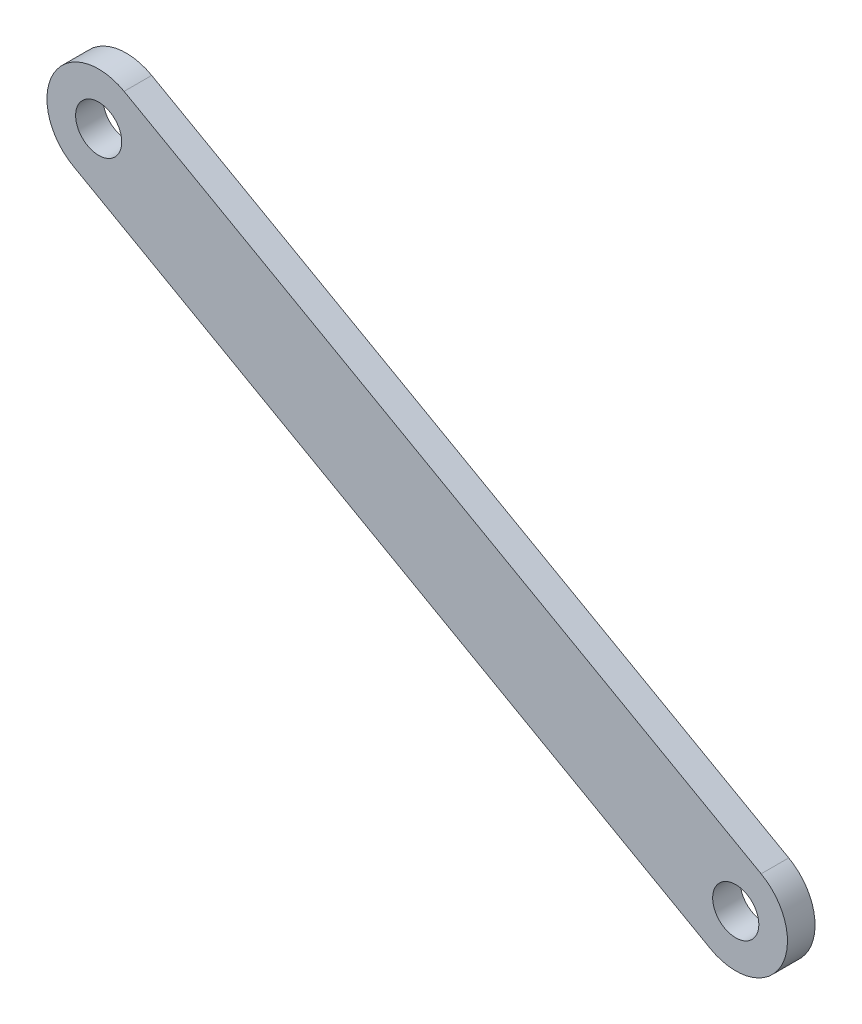
ISO-10303-21;
HEADER;
FILE_DESCRIPTION(('STEP AP214'),'2;1');
FILE_NAME('part.step','',(''),(''),'','','');
FILE_SCHEMA(('AUTOMOTIVE_DESIGN { 1 0 10303 214 1 1 1 1 }'));
ENDSEC;
DATA;
#1=APPLICATION_CONTEXT('core data for automotive mechanical design processes');
#2=APPLICATION_PROTOCOL_DEFINITION('international standard','automotive_design',2000,#1);
#3=PRODUCT_CONTEXT('',#1,'mechanical');
#4=PRODUCT('Part','Part','',(#3));
#5=PRODUCT_RELATED_PRODUCT_CATEGORY('part','',(#4));
#6=PRODUCT_DEFINITION_FORMATION('','',#4);
#7=PRODUCT_DEFINITION_CONTEXT('part definition',#1,'design');
#8=PRODUCT_DEFINITION('design','',#6,#7);
#9=PRODUCT_DEFINITION_SHAPE('','',#8);
#10=(LENGTH_UNIT() NAMED_UNIT(*) SI_UNIT(.MILLI.,.METRE.));
#11=(NAMED_UNIT(*) PLANE_ANGLE_UNIT() SI_UNIT($,.RADIAN.));
#12=(NAMED_UNIT(*) SI_UNIT($,.STERADIAN.) SOLID_ANGLE_UNIT());
#13=UNCERTAINTY_MEASURE_WITH_UNIT(LENGTH_MEASURE(1.E-05),#10,'distance_accuracy_value','');
#14=(GEOMETRIC_REPRESENTATION_CONTEXT(3) GLOBAL_UNCERTAINTY_ASSIGNED_CONTEXT((#13)) GLOBAL_UNIT_ASSIGNED_CONTEXT((#10,
#11,#12)) REPRESENTATION_CONTEXT('',''));
#15=CARTESIAN_POINT('',(0.,0.,0.));
#16=DIRECTION('',(0.,0.,1.));
#17=DIRECTION('',(1.,0.,0.));
#18=AXIS2_PLACEMENT_3D('',#15,#16,#17);
#19=CARTESIAN_POINT('',(760.406898190295,768.139812815871,6.35));
#20=DIRECTION('',(0.,0.,1.));
#21=DIRECTION('',(1.,0.,0.));
#22=AXIS2_PLACEMENT_3D('',#19,#20,#21);
#23=PLANE('',#22);
#24=DIRECTION('',(-0.871109803709392,0.491088291329966,0.));
#25=VECTOR('',#24,1.);
#26=CARTESIAN_POINT('',(918.709687883823,706.235448125224,6.35));
#27=LINE('',#26,#25);
#28=CARTESIAN_POINT('',(625.494788712281,871.535394485004,6.35));
#29=VERTEX_POINT('',#28);
#30=CARTESIAN_POINT('',(918.709687883823,706.235448125224,6.35));
#31=VERTEX_POINT('',#30);
#32=EDGE_CURVE('E67',#29,#31,#27,.F.);
#33=ORIENTED_EDGE('',*,*,#32,.F.);
#34=CARTESIAN_POINT('',(613.799448604524,850.789785995761,6.35));
#35=DIRECTION('',(0.,0.,-1.));
#36=DIRECTION('',(-1.,0.,0.));
#37=AXIS2_PLACEMENT_3D('',#34,#35,#36);
#38=CIRCLE('',#37,23.8151475289372);
#39=CARTESIAN_POINT('',(602.104108496767,830.044177506518,6.35));
#40=VERTEX_POINT('',#39);
#41=EDGE_CURVE('E58',#40,#29,#38,.T.);
#42=ORIENTED_EDGE('',*,*,#41,.F.);
#43=DIRECTION('',(0.871109803709392,-0.491088291329966,0.));
#44=VECTOR('',#43,1.);
#45=CARTESIAN_POINT('',(602.104108496767,830.044177506518,6.35));
#46=LINE('',#45,#44);
#47=CARTESIAN_POINT('',(895.319007668309,664.744231146739,6.35));
#48=VERTEX_POINT('',#47);
#49=EDGE_CURVE('E53',#48,#40,#46,.F.);
#50=ORIENTED_EDGE('',*,*,#49,.F.);
#51=CARTESIAN_POINT('',(907.014347776066,685.489839635981,6.35));
#52=DIRECTION('',(0.,0.,-1.));
#53=DIRECTION('',(-1.,0.,0.));
#54=AXIS2_PLACEMENT_3D('',#51,#52,#53);
#55=CIRCLE('',#54,23.8151475289372);
#56=EDGE_CURVE('E71',#31,#48,#55,.T.);
#57=ORIENTED_EDGE('',*,*,#56,.F.);
#58=EDGE_LOOP('',(#33,#42,#50,#57));
#59=FACE_BOUND('',#58,.T.);
#60=CARTESIAN_POINT('',(907.014347776066,685.489839635981,6.35));
#61=DIRECTION('',(0.,0.,-1.));
#62=DIRECTION('',(-1.,0.,0.));
#63=AXIS2_PLACEMENT_3D('',#60,#61,#62);
#64=CIRCLE('',#63,10.6212965715647);
#65=CARTESIAN_POINT('',(896.393051204501,685.489839635981,6.35));
#66=VERTEX_POINT('',#65);
#67=EDGE_CURVE('E75',#66,#66,#64,.F.);
#68=ORIENTED_EDGE('',*,*,#67,.F.);
#69=EDGE_LOOP('',(#68));
#70=FACE_BOUND('',#69,.T.);
#71=CARTESIAN_POINT('',(613.799448604524,850.789785995761,6.35));
#72=DIRECTION('',(0.,0.,-1.));
#73=DIRECTION('',(-1.,0.,0.));
#74=AXIS2_PLACEMENT_3D('',#71,#72,#73);
#75=CIRCLE('',#74,10.6212965715647);
#76=CARTESIAN_POINT('',(603.17815203296,850.789785995761,6.35));
#77=VERTEX_POINT('',#76);
#78=EDGE_CURVE('E20',#77,#77,#75,.F.);
#79=ORIENTED_EDGE('',*,*,#78,.F.);
#80=EDGE_LOOP('',(#79));
#81=FACE_BOUND('',#80,.T.);
#82=ADVANCED_FACE('F17',(#59,#70,#81),#23,.T.);
#83=CARTESIAN_POINT('',(613.799448604524,850.789785995761,6.35));
#84=DIRECTION('',(0.,0.,-1.));
#85=DIRECTION('',(-1.,0.,0.));
#86=AXIS2_PLACEMENT_3D('',#83,#84,#85);
#87=CYLINDRICAL_SURFACE('',#86,10.6212965715647);
#88=CARTESIAN_POINT('',(613.799448604524,850.789785995761,-6.35));
#89=DIRECTION('',(0.,0.,-1.));
#90=DIRECTION('',(-1.,0.,0.));
#91=AXIS2_PLACEMENT_3D('',#88,#89,#90);
#92=CIRCLE('',#91,10.6212965715647);
#93=CARTESIAN_POINT('',(603.17815203296,850.789785995761,-6.35));
#94=VERTEX_POINT('',#93);
#95=EDGE_CURVE('E90',#94,#94,#92,.T.);
#96=ORIENTED_EDGE('',*,*,#95,.T.);
#97=EDGE_LOOP('',(#96));
#98=FACE_BOUND('',#97,.T.);
#99=ORIENTED_EDGE('',*,*,#78,.T.);
#100=EDGE_LOOP('',(#99));
#101=FACE_BOUND('',#100,.T.);
#102=ADVANCED_FACE('F100',(#98,#101),#87,.F.);
#103=CARTESIAN_POINT('',(907.014347776066,685.489839635981,6.35));
#104=DIRECTION('',(0.,0.,-1.));
#105=DIRECTION('',(-1.,0.,0.));
#106=AXIS2_PLACEMENT_3D('',#103,#104,#105);
#107=CYLINDRICAL_SURFACE('',#106,10.6212965715647);
#108=CARTESIAN_POINT('',(907.014347776066,685.489839635981,-6.35));
#109=DIRECTION('',(0.,0.,-1.));
#110=DIRECTION('',(-1.,0.,0.));
#111=AXIS2_PLACEMENT_3D('',#108,#109,#110);
#112=CIRCLE('',#111,10.6212965715647);
#113=CARTESIAN_POINT('',(896.393051204501,685.489839635981,-6.35));
#114=VERTEX_POINT('',#113);
#115=EDGE_CURVE('E87',#114,#114,#112,.T.);
#116=ORIENTED_EDGE('',*,*,#115,.T.);
#117=EDGE_LOOP('',(#116));
#118=FACE_BOUND('',#117,.T.);
#119=ORIENTED_EDGE('',*,*,#67,.T.);
#120=EDGE_LOOP('',(#119));
#121=FACE_BOUND('',#120,.T.);
#122=ADVANCED_FACE('F107',(#118,#121),#107,.F.);
#123=CARTESIAN_POINT('',(918.709687883823,706.235448125224,6.35));
#124=DIRECTION('',(0.491088291329966,0.871109803709392,0.));
#125=DIRECTION('',(-0.871109803709392,0.491088291329966,0.));
#126=AXIS2_PLACEMENT_3D('',#123,#124,#125);
#127=PLANE('',#126);
#128=DIRECTION('',(0.,0.,-1.));
#129=VECTOR('',#128,1.);
#130=CARTESIAN_POINT('',(918.709687883823,706.235448125224,6.35));
#131=LINE('',#130,#129);
#132=CARTESIAN_POINT('',(918.709687883823,706.235448125224,-6.35));
#133=VERTEX_POINT('',#132);
#134=EDGE_CURVE('E93',#133,#31,#131,.F.);
#135=ORIENTED_EDGE('',*,*,#134,.F.);
#136=DIRECTION('',(-0.871109803709392,0.491088291329965,0.));
#137=VECTOR('',#136,1.);
#138=CARTESIAN_POINT('',(918.709687883823,706.235448125224,-6.35));
#139=LINE('',#138,#137);
#140=CARTESIAN_POINT('',(625.494788712281,871.535394485004,-6.35));
#141=VERTEX_POINT('',#140);
#142=EDGE_CURVE('E79',#133,#141,#139,.T.);
#143=ORIENTED_EDGE('',*,*,#142,.T.);
#144=DIRECTION('',(0.,0.,-1.));
#145=VECTOR('',#144,1.);
#146=CARTESIAN_POINT('',(625.494788712281,871.535394485004,6.35));
#147=LINE('',#146,#145);
#148=EDGE_CURVE('E63',#29,#141,#147,.T.);
#149=ORIENTED_EDGE('',*,*,#148,.F.);
#150=ORIENTED_EDGE('',*,*,#32,.T.);
#151=EDGE_LOOP('',(#135,#143,#149,#150));
#152=FACE_BOUND('',#151,.T.);
#153=ADVANCED_FACE('F78',(#152),#127,.T.);
#154=CARTESIAN_POINT('',(613.799448604524,850.789785995761,6.35));
#155=DIRECTION('',(0.,0.,-1.));
#156=DIRECTION('',(-1.,0.,0.));
#157=AXIS2_PLACEMENT_3D('',#154,#155,#156);
#158=CYLINDRICAL_SURFACE('',#157,23.8151475289372);
#159=ORIENTED_EDGE('',*,*,#148,.T.);
#160=CARTESIAN_POINT('',(613.799448604524,850.789785995761,-6.35));
#161=DIRECTION('',(0.,0.,-1.));
#162=DIRECTION('',(-1.,0.,0.));
#163=AXIS2_PLACEMENT_3D('',#160,#161,#162);
#164=CIRCLE('',#163,23.8151475289372);
#165=CARTESIAN_POINT('',(602.104108496767,830.044177506518,-6.35));
#166=VERTEX_POINT('',#165);
#167=EDGE_CURVE('E85',#141,#166,#164,.F.);
#168=ORIENTED_EDGE('',*,*,#167,.T.);
#169=DIRECTION('',(0.,0.,1.));
#170=VECTOR('',#169,1.);
#171=CARTESIAN_POINT('',(602.104108496767,830.044177506518,6.35));
#172=LINE('',#171,#170);
#173=EDGE_CURVE('E65',#40,#166,#172,.F.);
#174=ORIENTED_EDGE('',*,*,#173,.F.);
#175=ORIENTED_EDGE('',*,*,#41,.T.);
#176=EDGE_LOOP('',(#159,#168,#174,#175));
#177=FACE_BOUND('',#176,.T.);
#178=ADVANCED_FACE('F60',(#177),#158,.T.);
#179=CARTESIAN_POINT('',(602.104108496767,830.044177506518,6.35));
#180=DIRECTION('',(-0.491088291329966,-0.871109803709392,0.));
#181=DIRECTION('',(0.871109803709392,-0.491088291329966,0.));
#182=AXIS2_PLACEMENT_3D('',#179,#180,#181);
#183=PLANE('',#182);
#184=ORIENTED_EDGE('',*,*,#173,.T.);
#185=DIRECTION('',(0.871109803709392,-0.491088291329965,0.));
#186=VECTOR('',#185,1.);
#187=CARTESIAN_POINT('',(602.104108496767,830.044177506518,-6.35));
#188=LINE('',#187,#186);
#189=CARTESIAN_POINT('',(895.319007668309,664.744231146739,-6.35));
#190=VERTEX_POINT('',#189);
#191=EDGE_CURVE('E26',#166,#190,#188,.T.);
#192=ORIENTED_EDGE('',*,*,#191,.T.);
#193=DIRECTION('',(0.,0.,-1.));
#194=VECTOR('',#193,1.);
#195=CARTESIAN_POINT('',(895.319007668309,664.744231146739,6.35));
#196=LINE('',#195,#194);
#197=EDGE_CURVE('E34',#48,#190,#196,.T.);
#198=ORIENTED_EDGE('',*,*,#197,.F.);
#199=ORIENTED_EDGE('',*,*,#49,.T.);
#200=EDGE_LOOP('',(#184,#192,#198,#199));
#201=FACE_BOUND('',#200,.T.);
#202=ADVANCED_FACE('F117',(#201),#183,.T.);
#203=CARTESIAN_POINT('',(907.014347776066,685.489839635981,6.35));
#204=DIRECTION('',(0.,0.,-1.));
#205=DIRECTION('',(-1.,0.,0.));
#206=AXIS2_PLACEMENT_3D('',#203,#204,#205);
#207=CYLINDRICAL_SURFACE('',#206,23.8151475289372);
#208=ORIENTED_EDGE('',*,*,#197,.T.);
#209=CARTESIAN_POINT('',(907.014347776066,685.489839635981,-6.35));
#210=DIRECTION('',(0.,0.,-1.));
#211=DIRECTION('',(-1.,0.,0.));
#212=AXIS2_PLACEMENT_3D('',#209,#210,#211);
#213=CIRCLE('',#212,23.8151475289372);
#214=EDGE_CURVE('E11',#190,#133,#213,.F.);
#215=ORIENTED_EDGE('',*,*,#214,.T.);
#216=ORIENTED_EDGE('',*,*,#134,.T.);
#217=ORIENTED_EDGE('',*,*,#56,.T.);
#218=EDGE_LOOP('',(#208,#215,#216,#217));
#219=FACE_BOUND('',#218,.T.);
#220=ADVANCED_FACE('F111',(#219),#207,.T.);
#221=CARTESIAN_POINT('',(760.406898190295,768.139812815871,-6.35));
#222=DIRECTION('',(0.,0.,1.));
#223=DIRECTION('',(1.,0.,0.));
#224=AXIS2_PLACEMENT_3D('',#221,#222,#223);
#225=PLANE('',#224);
#226=ORIENTED_EDGE('',*,*,#191,.F.);
#227=ORIENTED_EDGE('',*,*,#167,.F.);
#228=ORIENTED_EDGE('',*,*,#142,.F.);
#229=ORIENTED_EDGE('',*,*,#214,.F.);
#230=EDGE_LOOP('',(#226,#227,#228,#229));
#231=FACE_BOUND('',#230,.T.);
#232=ORIENTED_EDGE('',*,*,#115,.F.);
#233=EDGE_LOOP('',(#232));
#234=FACE_BOUND('',#233,.T.);
#235=ORIENTED_EDGE('',*,*,#95,.F.);
#236=EDGE_LOOP('',(#235));
#237=FACE_BOUND('',#236,.T.);
#238=ADVANCED_FACE('F109',(#231,#234,#237),#225,.F.);
#239=CLOSED_SHELL('',(#82,#102,#122,#153,#178,#202,#220,#238));
#240=MANIFOLD_SOLID_BREP('B1',#239);
#241=ADVANCED_BREP_SHAPE_REPRESENTATION('',(#18,#240),#14);
#242=SHAPE_DEFINITION_REPRESENTATION(#9,#241);
ENDSEC;
END-ISO-10303-21;
